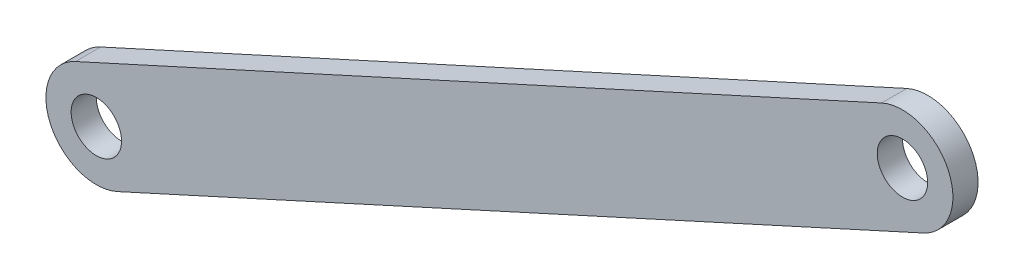
ISO-10303-21;
HEADER;
FILE_DESCRIPTION(('STEP AP214'),'2;1');
FILE_NAME('part.step','',(''),(''),'','','');
FILE_SCHEMA(('AUTOMOTIVE_DESIGN { 1 0 10303 214 1 1 1 1 }'));
ENDSEC;
DATA;
#1=APPLICATION_CONTEXT('core data for automotive mechanical design processes');
#2=APPLICATION_PROTOCOL_DEFINITION('international standard','automotive_design',2000,#1);
#3=PRODUCT_CONTEXT('',#1,'mechanical');
#4=PRODUCT('Part','Part','',(#3));
#5=PRODUCT_RELATED_PRODUCT_CATEGORY('part','',(#4));
#6=PRODUCT_DEFINITION_FORMATION('','',#4);
#7=PRODUCT_DEFINITION_CONTEXT('part definition',#1,'design');
#8=PRODUCT_DEFINITION('design','',#6,#7);
#9=PRODUCT_DEFINITION_SHAPE('','',#8);
#10=(LENGTH_UNIT() NAMED_UNIT(*) SI_UNIT(.MILLI.,.METRE.));
#11=(NAMED_UNIT(*) PLANE_ANGLE_UNIT() SI_UNIT($,.RADIAN.));
#12=(NAMED_UNIT(*) SI_UNIT($,.STERADIAN.) SOLID_ANGLE_UNIT());
#13=UNCERTAINTY_MEASURE_WITH_UNIT(LENGTH_MEASURE(1.E-05),#10,'distance_accuracy_value','');
#14=(GEOMETRIC_REPRESENTATION_CONTEXT(3) GLOBAL_UNCERTAINTY_ASSIGNED_CONTEXT((#13)) GLOBAL_UNIT_ASSIGNED_CONTEXT((#10,
#11,#12)) REPRESENTATION_CONTEXT('',''));
#15=CARTESIAN_POINT('',(0.,0.,0.));
#16=DIRECTION('',(0.,0.,1.));
#17=DIRECTION('',(1.,0.,0.));
#18=AXIS2_PLACEMENT_3D('',#15,#16,#17);
#19=CARTESIAN_POINT('',(-74.7943653809361,8.1431702058961,3.175));
#20=DIRECTION('',(0.,0.,1.));
#21=DIRECTION('',(1.,0.,0.));
#22=AXIS2_PLACEMENT_3D('',#19,#20,#21);
#23=PLANE('',#22);
#24=CARTESIAN_POINT('',(-24.0135350971278,31.2720974548427,3.175));
#25=DIRECTION('',(0.,0.,1.));
#26=DIRECTION('',(1.,0.,0.));
#27=AXIS2_PLACEMENT_3D('',#24,#25,#26);
#28=CIRCLE('',#27,1.5875);
#29=CARTESIAN_POINT('',(-22.4260350971278,31.2720974548427,3.175));
#30=VERTEX_POINT('',#29);
#31=EDGE_CURVE('E101',#30,#30,#28,.T.);
#32=ORIENTED_EDGE('',*,*,#31,.F.);
#33=EDGE_LOOP('',(#32));
#34=FACE_BOUND('',#33,.T.);
#35=CARTESIAN_POINT('',(-74.7943653809361,8.1431702058961,3.175));
#36=DIRECTION('',(0.,0.,1.));
#37=DIRECTION('',(1.,0.,0.));
#38=AXIS2_PLACEMENT_3D('',#35,#36,#37);
#39=CIRCLE('',#38,3.17500000000001);
#40=CARTESIAN_POINT('',(-76.110393051463,11.0325812480304,3.175));
#41=VERTEX_POINT('',#40);
#42=CARTESIAN_POINT('',(-73.4783377104091,5.25375916376185,3.175));
#43=VERTEX_POINT('',#42);
#44=EDGE_CURVE('E86',#41,#43,#39,.T.);
#45=ORIENTED_EDGE('',*,*,#44,.T.);
#46=DIRECTION('',(0.910050721932047,0.414496904102985,0.));
#47=VECTOR('',#46,1.);
#48=CARTESIAN_POINT('',(-73.4783377104091,5.25375916376185,3.175));
#49=LINE('',#48,#47);
#50=CARTESIAN_POINT('',(-22.6975074266009,28.3826864127084,3.175));
#51=VERTEX_POINT('',#50);
#52=EDGE_CURVE('E81',#43,#51,#49,.T.);
#53=ORIENTED_EDGE('',*,*,#52,.T.);
#54=CARTESIAN_POINT('',(-24.0135350971278,31.2720974548427,3.175));
#55=DIRECTION('',(0.,0.,1.));
#56=DIRECTION('',(1.,0.,0.));
#57=AXIS2_PLACEMENT_3D('',#54,#55,#56);
#58=CIRCLE('',#57,3.175);
#59=CARTESIAN_POINT('',(-25.3295627676548,34.1615084969769,3.175));
#60=VERTEX_POINT('',#59);
#61=EDGE_CURVE('E84',#51,#60,#58,.T.);
#62=ORIENTED_EDGE('',*,*,#61,.T.);
#63=DIRECTION('',(-0.910050721932047,-0.414496904102985,0.));
#64=VECTOR('',#63,1.);
#65=CARTESIAN_POINT('',(-76.110393051463,11.0325812480304,3.175));
#66=LINE('',#65,#64);
#67=EDGE_CURVE('E51',#60,#41,#66,.T.);
#68=ORIENTED_EDGE('',*,*,#67,.T.);
#69=EDGE_LOOP('',(#45,#53,#62,#68));
#70=FACE_BOUND('',#69,.T.);
#71=CARTESIAN_POINT('',(-74.7943653809361,8.1431702058961,3.175));
#72=DIRECTION('',(0.,0.,1.));
#73=DIRECTION('',(1.,0.,0.));
#74=AXIS2_PLACEMENT_3D('',#71,#72,#73);
#75=CIRCLE('',#74,1.5875);
#76=CARTESIAN_POINT('',(-73.2068653809361,8.1431702058961,3.175));
#77=VERTEX_POINT('',#76);
#78=EDGE_CURVE('E116',#77,#77,#75,.T.);
#79=ORIENTED_EDGE('',*,*,#78,.F.);
#80=EDGE_LOOP('',(#79));
#81=FACE_BOUND('',#80,.T.);
#82=ADVANCED_FACE('F34',(#34,#70,#81),#23,.T.);
#83=CARTESIAN_POINT('',(-74.7943653809361,8.1431702058961,1.5875));
#84=DIRECTION('',(0.,0.,1.));
#85=DIRECTION('',(1.,0.,0.));
#86=AXIS2_PLACEMENT_3D('',#83,#84,#85);
#87=PLANE('',#86);
#88=CARTESIAN_POINT('',(-24.0135350971278,31.2720974548427,1.5875));
#89=DIRECTION('',(0.,0.,1.));
#90=DIRECTION('',(1.,0.,0.));
#91=AXIS2_PLACEMENT_3D('',#88,#89,#90);
#92=CIRCLE('',#91,1.5875);
#93=CARTESIAN_POINT('',(-22.4260350971278,31.2720974548427,1.5875));
#94=VERTEX_POINT('',#93);
#95=EDGE_CURVE('E113',#94,#94,#92,.T.);
#96=ORIENTED_EDGE('',*,*,#95,.T.);
#97=EDGE_LOOP('',(#96));
#98=FACE_BOUND('',#97,.T.);
#99=CARTESIAN_POINT('',(-74.7943653809361,8.1431702058961,1.5875));
#100=DIRECTION('',(0.,0.,1.));
#101=DIRECTION('',(1.,0.,0.));
#102=AXIS2_PLACEMENT_3D('',#99,#100,#101);
#103=CIRCLE('',#102,3.17500000000001);
#104=CARTESIAN_POINT('',(-76.110393051463,11.0325812480304,1.5875));
#105=VERTEX_POINT('',#104);
#106=CARTESIAN_POINT('',(-73.4783377104091,5.25375916376185,1.5875));
#107=VERTEX_POINT('',#106);
#108=EDGE_CURVE('E98',#105,#107,#103,.T.);
#109=ORIENTED_EDGE('',*,*,#108,.F.);
#110=DIRECTION('',(-0.910050721932047,-0.414496904102985,0.));
#111=VECTOR('',#110,1.);
#112=CARTESIAN_POINT('',(-76.110393051463,11.0325812480304,1.5875));
#113=LINE('',#112,#111);
#114=CARTESIAN_POINT('',(-25.3295627676548,34.1615084969769,1.5875));
#115=VERTEX_POINT('',#114);
#116=EDGE_CURVE('E74',#115,#105,#113,.T.);
#117=ORIENTED_EDGE('',*,*,#116,.F.);
#118=CARTESIAN_POINT('',(-24.0135350971278,31.2720974548427,1.5875));
#119=DIRECTION('',(0.,0.,1.));
#120=DIRECTION('',(1.,0.,0.));
#121=AXIS2_PLACEMENT_3D('',#118,#119,#120);
#122=CIRCLE('',#121,3.175);
#123=CARTESIAN_POINT('',(-22.6975074266009,28.3826864127084,1.5875));
#124=VERTEX_POINT('',#123);
#125=EDGE_CURVE('E68',#124,#115,#122,.T.);
#126=ORIENTED_EDGE('',*,*,#125,.F.);
#127=DIRECTION('',(0.910050721932047,0.414496904102985,0.));
#128=VECTOR('',#127,1.);
#129=CARTESIAN_POINT('',(-73.4783377104091,5.25375916376185,1.5875));
#130=LINE('',#129,#128);
#131=EDGE_CURVE('E90',#107,#124,#130,.T.);
#132=ORIENTED_EDGE('',*,*,#131,.F.);
#133=EDGE_LOOP('',(#109,#117,#126,#132));
#134=FACE_BOUND('',#133,.T.);
#135=CARTESIAN_POINT('',(-74.7943653809361,8.1431702058961,1.5875));
#136=DIRECTION('',(0.,0.,1.));
#137=DIRECTION('',(1.,0.,0.));
#138=AXIS2_PLACEMENT_3D('',#135,#136,#137);
#139=CIRCLE('',#138,1.5875);
#140=CARTESIAN_POINT('',(-73.2068653809361,8.1431702058961,1.5875));
#141=VERTEX_POINT('',#140);
#142=EDGE_CURVE('E119',#141,#141,#139,.T.);
#143=ORIENTED_EDGE('',*,*,#142,.T.);
#144=EDGE_LOOP('',(#143));
#145=FACE_BOUND('',#144,.T.);
#146=ADVANCED_FACE('F109',(#98,#134,#145),#87,.F.);
#147=CARTESIAN_POINT('',(-74.7943653809361,8.1431702058961,3.175));
#148=DIRECTION('',(0.,0.,-1.));
#149=DIRECTION('',(-1.,0.,0.));
#150=AXIS2_PLACEMENT_3D('',#147,#148,#149);
#151=CYLINDRICAL_SURFACE('',#150,3.17500000000001);
#152=ORIENTED_EDGE('',*,*,#108,.T.);
#153=DIRECTION('',(0.,0.,-1.));
#154=VECTOR('',#153,1.);
#155=CARTESIAN_POINT('',(-73.4783377104091,5.25375916376185,3.175));
#156=LINE('',#155,#154);
#157=EDGE_CURVE('E11',#43,#107,#156,.T.);
#158=ORIENTED_EDGE('',*,*,#157,.F.);
#159=ORIENTED_EDGE('',*,*,#44,.F.);
#160=DIRECTION('',(0.,0.,-1.));
#161=VECTOR('',#160,1.);
#162=CARTESIAN_POINT('',(-76.110393051463,11.0325812480304,3.175));
#163=LINE('',#162,#161);
#164=EDGE_CURVE('E94',#41,#105,#163,.T.);
#165=ORIENTED_EDGE('',*,*,#164,.T.);
#166=EDGE_LOOP('',(#152,#158,#159,#165));
#167=FACE_BOUND('',#166,.T.);
#168=ADVANCED_FACE('F36',(#167),#151,.T.);
#169=CARTESIAN_POINT('',(-73.4783377104091,5.25375916376185,3.175));
#170=DIRECTION('',(-0.414496904102985,0.910050721932047,0.));
#171=DIRECTION('',(-0.910050721932047,-0.414496904102985,0.));
#172=AXIS2_PLACEMENT_3D('',#169,#170,#171);
#173=PLANE('',#172);
#174=ORIENTED_EDGE('',*,*,#131,.T.);
#175=DIRECTION('',(0.,0.,-1.));
#176=VECTOR('',#175,1.);
#177=CARTESIAN_POINT('',(-22.6975074266009,28.3826864127084,3.175));
#178=LINE('',#177,#176);
#179=EDGE_CURVE('E43',#51,#124,#178,.T.);
#180=ORIENTED_EDGE('',*,*,#179,.F.);
#181=ORIENTED_EDGE('',*,*,#52,.F.);
#182=ORIENTED_EDGE('',*,*,#157,.T.);
#183=EDGE_LOOP('',(#174,#180,#181,#182));
#184=FACE_BOUND('',#183,.T.);
#185=ADVANCED_FACE('F89',(#184),#173,.F.);
#186=CARTESIAN_POINT('',(-24.0135350971278,31.2720974548427,3.175));
#187=DIRECTION('',(0.,0.,-1.));
#188=DIRECTION('',(-1.,0.,0.));
#189=AXIS2_PLACEMENT_3D('',#186,#187,#188);
#190=CYLINDRICAL_SURFACE('',#189,3.175);
#191=ORIENTED_EDGE('',*,*,#125,.T.);
#192=DIRECTION('',(0.,0.,-1.));
#193=VECTOR('',#192,1.);
#194=CARTESIAN_POINT('',(-25.3295627676548,34.1615084969769,3.175));
#195=LINE('',#194,#193);
#196=EDGE_CURVE('E91',#60,#115,#195,.T.);
#197=ORIENTED_EDGE('',*,*,#196,.F.);
#198=ORIENTED_EDGE('',*,*,#61,.F.);
#199=ORIENTED_EDGE('',*,*,#179,.T.);
#200=EDGE_LOOP('',(#191,#197,#198,#199));
#201=FACE_BOUND('',#200,.T.);
#202=ADVANCED_FACE('F92',(#201),#190,.T.);
#203=CARTESIAN_POINT('',(-76.110393051463,11.0325812480304,3.175));
#204=DIRECTION('',(0.414496904102985,-0.910050721932048,0.));
#205=DIRECTION('',(0.910050721932048,0.414496904102985,0.));
#206=AXIS2_PLACEMENT_3D('',#203,#204,#205);
#207=PLANE('',#206);
#208=ORIENTED_EDGE('',*,*,#116,.T.);
#209=ORIENTED_EDGE('',*,*,#164,.F.);
#210=ORIENTED_EDGE('',*,*,#67,.F.);
#211=ORIENTED_EDGE('',*,*,#196,.T.);
#212=EDGE_LOOP('',(#208,#209,#210,#211));
#213=FACE_BOUND('',#212,.T.);
#214=ADVANCED_FACE('F106',(#213),#207,.F.);
#215=CARTESIAN_POINT('',(-24.0135350971278,31.2720974548427,3.175));
#216=DIRECTION('',(0.,0.,-1.));
#217=DIRECTION('',(-1.,0.,0.));
#218=AXIS2_PLACEMENT_3D('',#215,#216,#217);
#219=CYLINDRICAL_SURFACE('',#218,1.5875);
#220=ORIENTED_EDGE('',*,*,#31,.T.);
#221=EDGE_LOOP('',(#220));
#222=FACE_BOUND('',#221,.T.);
#223=ORIENTED_EDGE('',*,*,#95,.F.);
#224=EDGE_LOOP('',(#223));
#225=FACE_BOUND('',#224,.T.);
#226=ADVANCED_FACE('F137',(#222,#225),#219,.F.);
#227=CARTESIAN_POINT('',(-74.7943653809361,8.1431702058961,3.175));
#228=DIRECTION('',(0.,0.,-1.));
#229=DIRECTION('',(-1.,0.,0.));
#230=AXIS2_PLACEMENT_3D('',#227,#228,#229);
#231=CYLINDRICAL_SURFACE('',#230,1.5875);
#232=ORIENTED_EDGE('',*,*,#78,.T.);
#233=EDGE_LOOP('',(#232));
#234=FACE_BOUND('',#233,.T.);
#235=ORIENTED_EDGE('',*,*,#142,.F.);
#236=EDGE_LOOP('',(#235));
#237=FACE_BOUND('',#236,.T.);
#238=ADVANCED_FACE('F125',(#234,#237),#231,.F.);
#239=CLOSED_SHELL('',(#82,#146,#168,#185,#202,#214,#226,#238));
#240=MANIFOLD_SOLID_BREP('B2',#239);
#241=ADVANCED_BREP_SHAPE_REPRESENTATION('',(#18,#240),#14);
#242=SHAPE_DEFINITION_REPRESENTATION(#9,#241);
ENDSEC;
END-ISO-10303-21;
